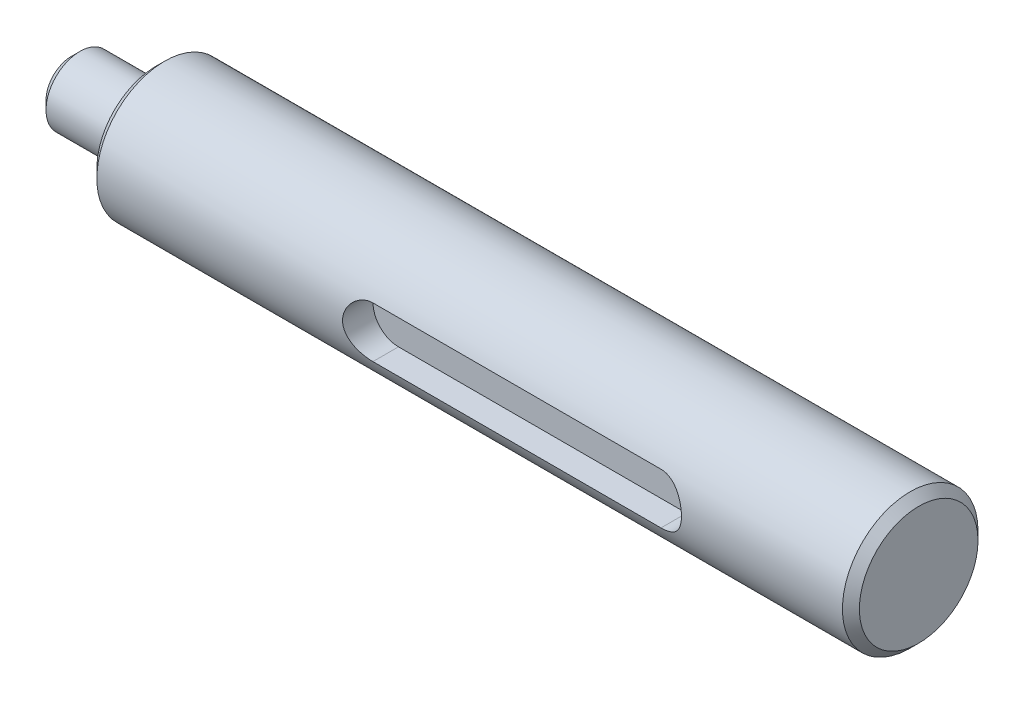
ISO-10303-21;
HEADER;
FILE_DESCRIPTION(('STEP AP214'),'2;1');
FILE_NAME('part.step','',(''),(''),'','','');
FILE_SCHEMA(('AUTOMOTIVE_DESIGN { 1 0 10303 214 1 1 1 1 }'));
ENDSEC;
DATA;
#1=APPLICATION_CONTEXT('core data for automotive mechanical design processes');
#2=APPLICATION_PROTOCOL_DEFINITION('international standard','automotive_design',2000,#1);
#3=PRODUCT_CONTEXT('',#1,'mechanical');
#4=PRODUCT('Part','Part','',(#3));
#5=PRODUCT_RELATED_PRODUCT_CATEGORY('part','',(#4));
#6=PRODUCT_DEFINITION_FORMATION('','',#4);
#7=PRODUCT_DEFINITION_CONTEXT('part definition',#1,'design');
#8=PRODUCT_DEFINITION('design','',#6,#7);
#9=PRODUCT_DEFINITION_SHAPE('','',#8);
#10=(LENGTH_UNIT() NAMED_UNIT(*) SI_UNIT(.MILLI.,.METRE.));
#11=(NAMED_UNIT(*) PLANE_ANGLE_UNIT() SI_UNIT($,.RADIAN.));
#12=(NAMED_UNIT(*) SI_UNIT($,.STERADIAN.) SOLID_ANGLE_UNIT());
#13=UNCERTAINTY_MEASURE_WITH_UNIT(LENGTH_MEASURE(1.E-05),#10,'distance_accuracy_value','');
#14=(GEOMETRIC_REPRESENTATION_CONTEXT(3) GLOBAL_UNCERTAINTY_ASSIGNED_CONTEXT((#13)) GLOBAL_UNIT_ASSIGNED_CONTEXT((#10,
#11,#12)) REPRESENTATION_CONTEXT('',''));
#15=CARTESIAN_POINT('',(0.,0.,0.));
#16=DIRECTION('',(0.,0.,1.));
#17=DIRECTION('',(1.,0.,0.));
#18=AXIS2_PLACEMENT_3D('',#15,#16,#17);
#19=CARTESIAN_POINT('',(-5.,0.,0.));
#20=DIRECTION('',(1.,0.,0.));
#21=DIRECTION('',(0.,0.,-1.));
#22=AXIS2_PLACEMENT_3D('',#19,#20,#21);
#23=PLANE('',#22);
#24=CARTESIAN_POINT('',(-5.,0.,0.));
#25=DIRECTION('',(1.,0.,0.));
#26=DIRECTION('',(0.,0.,-1.));
#27=AXIS2_PLACEMENT_3D('',#24,#25,#26);
#28=CIRCLE('',#27,1.5);
#29=CARTESIAN_POINT('',(-5.,0.,-1.5));
#30=VERTEX_POINT('',#29);
#31=EDGE_CURVE('E210',#30,#30,#28,.T.);
#32=ORIENTED_EDGE('',*,*,#31,.F.);
#33=EDGE_LOOP('',(#32));
#34=FACE_BOUND('',#33,.T.);
#35=ADVANCED_FACE('F17',(#34),#23,.F.);
#36=CARTESIAN_POINT('',(-5.,0.,0.));
#37=DIRECTION('',(1.,0.,0.));
#38=DIRECTION('',(0.,0.,-1.));
#39=AXIS2_PLACEMENT_3D('',#36,#37,#38);
#40=CONICAL_SURFACE('',#39,1.5,0.785398163397455);
#41=CARTESIAN_POINT('',(-4.5,0.,0.));
#42=DIRECTION('',(1.,0.,0.));
#43=DIRECTION('',(0.,0.,-1.));
#44=AXIS2_PLACEMENT_3D('',#41,#42,#43);
#45=CIRCLE('',#44,2.);
#46=CARTESIAN_POINT('',(-4.5,0.,-2.));
#47=VERTEX_POINT('',#46);
#48=EDGE_CURVE('E202',#47,#47,#45,.T.);
#49=ORIENTED_EDGE('',*,*,#48,.F.);
#50=EDGE_LOOP('',(#49));
#51=FACE_BOUND('',#50,.T.);
#52=ORIENTED_EDGE('',*,*,#31,.T.);
#53=EDGE_LOOP('',(#52));
#54=FACE_BOUND('',#53,.T.);
#55=ADVANCED_FACE('F167',(#51,#54),#40,.T.);
#56=CARTESIAN_POINT('',(45.,0.,0.));
#57=DIRECTION('',(1.,0.,0.));
#58=DIRECTION('',(0.,0.,-1.));
#59=AXIS2_PLACEMENT_3D('',#56,#57,#58);
#60=CYLINDRICAL_SURFACE('',#59,2.);
#61=CARTESIAN_POINT('',(-0.2,0.,0.));
#62=DIRECTION('',(1.,0.,0.));
#63=DIRECTION('',(0.,0.,-1.));
#64=AXIS2_PLACEMENT_3D('',#61,#62,#63);
#65=CIRCLE('',#64,2.);
#66=CARTESIAN_POINT('',(-0.2,0.,-2.));
#67=VERTEX_POINT('',#66);
#68=EDGE_CURVE('E198',#67,#67,#65,.T.);
#69=ORIENTED_EDGE('',*,*,#68,.F.);
#70=EDGE_LOOP('',(#69));
#71=FACE_BOUND('',#70,.T.);
#72=ORIENTED_EDGE('',*,*,#48,.T.);
#73=EDGE_LOOP('',(#72));
#74=FACE_BOUND('',#73,.T.);
#75=ADVANCED_FACE('F173',(#71,#74),#60,.T.);
#76=CARTESIAN_POINT('',(-0.200000000000017,0.,0.));
#77=DIRECTION('',(1.,0.,0.));
#78=DIRECTION('',(0.,0.,-1.));
#79=AXIS2_PLACEMENT_3D('',#76,#77,#78);
#80=TOROIDAL_SURFACE('',#79,2.2,0.200000000000017);
#81=CARTESIAN_POINT('',(0.,0.,0.));
#82=DIRECTION('',(1.,0.,0.));
#83=DIRECTION('',(0.,0.,-1.));
#84=AXIS2_PLACEMENT_3D('',#81,#82,#83);
#85=CIRCLE('',#84,2.2);
#86=CARTESIAN_POINT('',(0.,0.,-2.2));
#87=VERTEX_POINT('',#86);
#88=EDGE_CURVE('E197',#87,#87,#85,.T.);
#89=ORIENTED_EDGE('',*,*,#88,.F.);
#90=EDGE_LOOP('',(#89));
#91=FACE_BOUND('',#90,.T.);
#92=ORIENTED_EDGE('',*,*,#68,.T.);
#93=EDGE_LOOP('',(#92));
#94=FACE_BOUND('',#93,.T.);
#95=ADVANCED_FACE('F180',(#91,#94),#80,.F.);
#96=CARTESIAN_POINT('',(0.,2.2,0.));
#97=DIRECTION('',(1.,0.,0.));
#98=DIRECTION('',(0.,0.,-1.));
#99=AXIS2_PLACEMENT_3D('',#96,#97,#98);
#100=PLANE('',#99);
#101=CARTESIAN_POINT('',(0.,0.,0.));
#102=DIRECTION('',(1.,0.,0.));
#103=DIRECTION('',(0.,0.,-1.));
#104=AXIS2_PLACEMENT_3D('',#101,#102,#103);
#105=CIRCLE('',#104,3.5);
#106=CARTESIAN_POINT('',(0.,0.,-3.5));
#107=VERTEX_POINT('',#106);
#108=EDGE_CURVE('E194',#107,#107,#105,.T.);
#109=ORIENTED_EDGE('',*,*,#108,.F.);
#110=EDGE_LOOP('',(#109));
#111=FACE_BOUND('',#110,.T.);
#112=ORIENTED_EDGE('',*,*,#88,.T.);
#113=EDGE_LOOP('',(#112));
#114=FACE_BOUND('',#113,.T.);
#115=ADVANCED_FACE('F183',(#111,#114),#100,.F.);
#116=CARTESIAN_POINT('',(0.,0.,0.));
#117=DIRECTION('',(1.,0.,0.));
#118=DIRECTION('',(0.,0.,-1.));
#119=AXIS2_PLACEMENT_3D('',#116,#117,#118);
#120=CONICAL_SURFACE('',#119,3.5,0.785398163397448);
#121=CARTESIAN_POINT('',(0.5,0.,0.));
#122=DIRECTION('',(1.,0.,0.));
#123=DIRECTION('',(0.,0.,-1.));
#124=AXIS2_PLACEMENT_3D('',#121,#122,#123);
#125=CIRCLE('',#124,4.);
#126=CARTESIAN_POINT('',(0.5,0.,-4.));
#127=VERTEX_POINT('',#126);
#128=EDGE_CURVE('E90',#127,#127,#125,.T.);
#129=ORIENTED_EDGE('',*,*,#128,.F.);
#130=EDGE_LOOP('',(#129));
#131=FACE_BOUND('',#130,.T.);
#132=ORIENTED_EDGE('',*,*,#108,.T.);
#133=EDGE_LOOP('',(#132));
#134=FACE_BOUND('',#133,.T.);
#135=ADVANCED_FACE('F111',(#131,#134),#120,.T.);
#136=CARTESIAN_POINT('',(45.,0.,0.));
#137=DIRECTION('',(1.,0.,0.));
#138=DIRECTION('',(0.,0.,-1.));
#139=AXIS2_PLACEMENT_3D('',#136,#137,#138);
#140=CYLINDRICAL_SURFACE('',#139,4.);
#141=CARTESIAN_POINT('',(44.5,0.,0.));
#142=DIRECTION('',(1.,0.,0.));
#143=DIRECTION('',(0.,0.,-1.));
#144=AXIS2_PLACEMENT_3D('',#141,#142,#143);
#145=CIRCLE('',#144,4.);
#146=CARTESIAN_POINT('',(44.5,0.,-4.));
#147=VERTEX_POINT('',#146);
#148=EDGE_CURVE('E87',#147,#147,#145,.T.);
#149=ORIENTED_EDGE('',*,*,#148,.F.);
#150=EDGE_LOOP('',(#149));
#151=FACE_BOUND('',#150,.T.);
#152=DIRECTION('',(1.,0.,0.));
#153=VECTOR('',#152,1.);
#154=CARTESIAN_POINT('',(16.5,1.5,3.70809924354783));
#155=LINE('',#154,#153);
#156=CARTESIAN_POINT('',(16.5,1.5,3.70809924354783));
#157=VERTEX_POINT('',#156);
#158=CARTESIAN_POINT('',(33.5,1.5,3.70809924354783));
#159=VERTEX_POINT('',#158);
#160=EDGE_CURVE('E71',#157,#159,#155,.T.);
#161=ORIENTED_EDGE('',*,*,#160,.T.);
#162=CARTESIAN_POINT('',(33.5,1.5,3.70809924354783));
#163=CARTESIAN_POINT('',(33.5199450486581,1.50000089736899,3.70809856452194));
#164=CARTESIAN_POINT('',(33.5398904816375,1.49961124737892,3.70825648961619));
#165=CARTESIAN_POINT('',(33.5796340399623,1.49804869432538,3.70888816765675));
#166=CARTESIAN_POINT('',(33.5994323661552,1.49688017499157,3.70936015294496));
#167=CARTESIAN_POINT('',(33.6388825387993,1.49376374507018,3.71061619100091));
#168=CARTESIAN_POINT('',(33.6585346560803,1.4918187913755,3.71139905977317));
#169=CARTESIAN_POINT('',(33.697693113869,1.48715414794438,3.71327064511375));
#170=CARTESIAN_POINT('',(33.7171996639137,1.48443597633218,3.71435876230468));
#171=CARTESIAN_POINT('',(33.7560679004188,1.47822866178049,3.71683348672789));
#172=CARTESIAN_POINT('',(33.7754296059174,1.47473962207196,3.71822005399253));
#173=CARTESIAN_POINT('',(33.8140091478965,1.46699380876062,3.72128291475121));
#174=CARTESIAN_POINT('',(33.8332266930134,1.46273577328565,3.72295968425695));
#175=CARTESIAN_POINT('',(33.8715191427874,1.4534548854513,3.72659278835215));
#176=CARTESIAN_POINT('',(33.8905933400785,1.44842948130874,3.72855005430852));
#177=CARTESIAN_POINT('',(33.9286000094495,1.43761528232262,3.73273305403726));
#178=CARTESIAN_POINT('',(33.9475312683034,1.43182273696508,3.73496010187578));
#179=CARTESIAN_POINT('',(33.985168329086,1.41950699430011,3.73965820034778));
#180=CARTESIAN_POINT('',(34.0038735749353,1.41298229017736,3.74212975289855));
#181=CARTESIAN_POINT('',(34.0408951012299,1.39925302398884,3.74728494647122));
#182=CARTESIAN_POINT('',(34.0592128592872,1.39205202586604,3.7499674647739));
#183=CARTESIAN_POINT('',(34.0954584304663,1.37697300078356,3.75553054686646));
#184=CARTESIAN_POINT('',(34.1133874065149,1.36909749464294,3.75841036585242));
#185=CARTESIAN_POINT('',(34.1488594219785,1.35267293462389,3.7643528053963));
#186=CARTESIAN_POINT('',(34.1664031512844,1.34412523635835,3.76741505516591));
#187=CARTESIAN_POINT('',(34.2011085613983,1.32635906598519,3.77370645233928));
#188=CARTESIAN_POINT('',(34.2182703814861,1.31714084382769,3.7769355374234));
#189=CARTESIAN_POINT('',(34.2522159417151,1.29803631474787,3.7835438408551));
#190=CARTESIAN_POINT('',(34.26899920863,1.28814922738827,3.78692323295133));
#191=CARTESIAN_POINT('',(34.3021918757246,1.26770971937128,3.7938145309543));
#192=CARTESIAN_POINT('',(34.3186001469192,1.25715557808746,3.79732676932226));
#193=CARTESIAN_POINT('',(34.3510463192925,1.23538373386121,3.80446563644074));
#194=CARTESIAN_POINT('',(34.3670824081849,1.22416346725929,3.80809267818527));
#195=CARTESIAN_POINT('',(34.3987478822215,1.20109551185277,3.81543136818895));
#196=CARTESIAN_POINT('',(34.4143760025261,1.18924615383918,3.81914322495519));
#197=CARTESIAN_POINT('',(34.4450895144621,1.16501610604786,3.82660390758159));
#198=CARTESIAN_POINT('',(34.4601770051164,1.15263800487171,3.83035249657578));
#199=CARTESIAN_POINT('',(34.4897984519701,1.12735416450796,3.83786996434399));
#200=CARTESIAN_POINT('',(34.5043342455066,1.11445054116477,3.84163871718287));
#201=CARTESIAN_POINT('',(34.5328542980744,1.08811510673159,3.84918078191495));
#202=CARTESIAN_POINT('',(34.5468397407188,1.07468456901714,3.85295406374682));
#203=CARTESIAN_POINT('',(34.5742605789496,1.04729419068475,3.86048914558244));
#204=CARTESIAN_POINT('',(34.5876964388207,1.03333481686828,3.86425095268487));
#205=CARTESIAN_POINT('',(34.6140197999485,1.00488598186168,3.87174646042746));
#206=CARTESIAN_POINT('',(34.6269069906222,0.990396228849816,3.87548014418909));
#207=CARTESIAN_POINT('',(34.6521347898805,0.960886031135332,3.88290226084419));
#208=CARTESIAN_POINT('',(34.6644742718622,0.94586459734425,3.88659059012124));
#209=CARTESIAN_POINT('',(34.6886081831962,0.915290426695448,3.89390437994279));
#210=CARTESIAN_POINT('',(34.7004006430826,0.899736075080753,3.8975295877787));
#211=CARTESIAN_POINT('',(34.7234416800251,0.868098510736872,3.90469835573684));
#212=CARTESIAN_POINT('',(34.7346875164945,0.852013200770794,3.90824146547409));
#213=CARTESIAN_POINT('',(34.7565513756601,0.819434445163634,3.91520168747571));
#214=CARTESIAN_POINT('',(34.7671704034479,0.802941716594649,3.9186189979541));
#215=CARTESIAN_POINT('',(34.7877224622443,0.769614045226761,3.92530019992182));
#216=CARTESIAN_POINT('',(34.7976584918031,0.752781082748375,3.92856473884158));
#217=CARTESIAN_POINT('',(34.8168425606811,0.718772951170971,3.93492867875656));
#218=CARTESIAN_POINT('',(34.8260927865872,0.701599112488884,3.93802859478895));
#219=CARTESIAN_POINT('',(34.8439026880918,0.666908972708808,3.94405143664559));
#220=CARTESIAN_POINT('',(34.852463650375,0.649393389287445,3.94697468958522));
#221=CARTESIAN_POINT('',(34.8688927450906,0.61401987150133,3.9526320685094));
#222=CARTESIAN_POINT('',(34.8767611844706,0.596162093125522,3.95536627816737));
#223=CARTESIAN_POINT('',(34.8918029152238,0.560104476457852,3.96063319255055));
#224=CARTESIAN_POINT('',(34.8989754689702,0.541904299099427,3.96316568295882));
#225=CARTESIAN_POINT('',(34.9126234327671,0.505162482760767,3.96801652126187));
#226=CARTESIAN_POINT('',(34.9190970133416,0.486620089666016,3.97033430504127));
#227=CARTESIAN_POINT('',(34.9313441359663,0.449194437154995,3.97474286117349));
#228=CARTESIAN_POINT('',(34.9371147247672,0.430310098358728,3.97683267222212));
#229=CARTESIAN_POINT('',(34.9479529129768,0.392214942025615,3.98077077145582));
#230=CARTESIAN_POINT('',(34.9530169322277,0.373002978722608,3.98261782705184));
#231=CARTESIAN_POINT('',(34.9623847321422,0.334431890298367,3.98604177851591));
#232=CARTESIAN_POINT('',(34.9666907415375,0.315073377267811,3.98761946596504));
#233=CARTESIAN_POINT('',(34.9745202346462,0.276269646843665,3.99049518825004));
#234=CARTESIAN_POINT('',(34.9780471733009,0.256825218933224,3.9917944569881));
#235=CARTESIAN_POINT('',(34.9843190743405,0.217853921584761,3.99411060862672));
#236=CARTESIAN_POINT('',(34.9870663519509,0.198327474743152,3.99512832736641));
#237=CARTESIAN_POINT('',(34.991778490505,0.159196116709768,3.99687873484046));
#238=CARTESIAN_POINT('',(34.9937444694046,0.139591358470514,3.99761183080508));
#239=CARTESIAN_POINT('',(34.9968939152741,0.100307414369995,3.99879039637172));
#240=CARTESIAN_POINT('',(34.9980772619261,0.0806282175324005,3.99923582174851));
#241=CARTESIAN_POINT('',(34.9996612789958,0.0411993967179798,3.99983650156494));
#242=CARTESIAN_POINT('',(35.0000605737182,0.0214497097566775,3.99999124595597));
#243=CARTESIAN_POINT('',(35.0000764514507,-0.0181161360870476,4.00000805977239));
#244=CARTESIAN_POINT('',(34.9996904105448,-0.0379322962314546,3.9998691479908));
#245=CARTESIAN_POINT('',(34.9981351879993,-0.0776270725407904,3.99929618608449));
#246=CARTESIAN_POINT('',(34.9969621631572,-0.0975055163973702,3.99886068743215));
#247=CARTESIAN_POINT('',(34.9938416169736,-0.137223090792668,3.99769497621722));
#248=CARTESIAN_POINT('',(34.9918929268459,-0.157062116389304,3.99696431887947));
#249=CARTESIAN_POINT('',(34.9872267080505,-0.196541972565766,3.99521712031409));
#250=CARTESIAN_POINT('',(34.9845128479092,-0.216183296591103,3.99420194332114));
#251=CARTESIAN_POINT('',(34.9783204495627,-0.255262680106333,3.99189464356884));
#252=CARTESIAN_POINT('',(34.9748444385816,-0.274701194029206,3.99060343644653));
#253=CARTESIAN_POINT('',(34.9671323027238,-0.313372246727262,3.98775288734361));
#254=CARTESIAN_POINT('',(34.9628974884008,-0.33260508098722,3.98619400785915));
#255=CARTESIAN_POINT('',(34.9536721935787,-0.370862383722415,3.98281681696109));
#256=CARTESIAN_POINT('',(34.9486818310458,-0.389886884229085,3.98099854604965));
#257=CARTESIAN_POINT('',(34.9379498249106,-0.427725432529754,3.97711116041995));
#258=CARTESIAN_POINT('',(34.9322071519953,-0.446539152938039,3.97504170231701));
#259=CARTESIAN_POINT('',(34.9199750877886,-0.483954473328714,3.97066038210852));
#260=CARTESIAN_POINT('',(34.9134835854342,-0.50255530269457,3.9683478364134));
#261=CARTESIAN_POINT('',(34.8997574579093,-0.539543047472781,3.96348871229549));
#262=CARTESIAN_POINT('',(34.8925197183396,-0.557928677839426,3.96094115814073));
#263=CARTESIAN_POINT('',(34.8773414959637,-0.594405549589216,3.95563170066709));
#264=CARTESIAN_POINT('',(34.8694000780712,-0.612496360254044,3.9528695127492));
#265=CARTESIAN_POINT('',(34.8528674043422,-0.648249633234827,3.94716336986651));
#266=CARTESIAN_POINT('',(34.8442792013246,-0.665913644859606,3.94422027954586));
#267=CARTESIAN_POINT('',(34.8264554507235,-0.700811779758493,3.93816905470476));
#268=CARTESIAN_POINT('',(34.8172220153192,-0.718047076374335,3.93506146609069));
#269=CARTESIAN_POINT('',(34.7981112192282,-0.752089365050631,3.92869710372997));
#270=CARTESIAN_POINT('',(34.7882349737999,-0.768897032077975,3.92544059113624));
#271=CARTESIAN_POINT('',(34.7678415252772,-0.802085862639763,3.91879377204522));
#272=CARTESIAN_POINT('',(34.7573244806554,-0.818467130206,3.91540349870009));
#273=CARTESIAN_POINT('',(34.7356524065632,-0.850805326183809,3.90850405870109));
#274=CARTESIAN_POINT('',(34.7244966335254,-0.866761726994714,3.90499475549921));
#275=CARTESIAN_POINT('',(34.7015502349587,-0.898252885828872,3.89787160362012));
#276=CARTESIAN_POINT('',(34.6897580330447,-0.913786438681743,3.89425750667078));
#277=CARTESIAN_POINT('',(34.6655409008703,-0.944434088717742,3.88693883295457));
#278=CARTESIAN_POINT('',(34.6531136381786,-0.959546269436205,3.88323395321616));
#279=CARTESIAN_POINT('',(34.627672438963,-0.989309289100827,3.87575837909199));
#280=CARTESIAN_POINT('',(34.6146573083014,-1.00395907593639,3.871987561245));
#281=CARTESIAN_POINT('',(34.588139422907,-1.03267729410848,3.86442713168466));
#282=CARTESIAN_POINT('',(34.5746391666374,-1.04674807495339,3.86063768445456));
#283=CARTESIAN_POINT('',(34.54715196937,-1.07430126473969,3.85306114950972));
#284=CARTESIAN_POINT('',(34.533166971937,-1.08778562323666,3.84927410312045));
#285=CARTESIAN_POINT('',(34.5047090660023,-1.11416741510404,3.84172081417597));
#286=CARTESIAN_POINT('',(34.4902373253175,-1.12706610004442,3.83795454398939));
#287=CARTESIAN_POINT('',(34.4608040197574,-1.15227769663887,3.83046066755321));
#288=CARTESIAN_POINT('',(34.4458428688493,-1.16459108279046,3.82673303196849));
#289=CARTESIAN_POINT('',(34.4154289717717,-1.18863359128592,3.81933351452422));
#290=CARTESIAN_POINT('',(34.3999759214246,-1.20036234013546,3.81566166932152));
#291=CARTESIAN_POINT('',(34.368576421583,-1.22323729974505,3.80839006097582));
#292=CARTESIAN_POINT('',(34.3526290012407,-1.23438223123663,3.80479046598179));
#293=CARTESIAN_POINT('',(34.3202387020509,-1.25609112912262,3.79767903037953));
#294=CARTESIAN_POINT('',(34.3037942502823,-1.26665286663717,3.79416755112899));
#295=CARTESIAN_POINT('',(34.2704103848882,-1.28719699769113,3.78724728210048));
#296=CARTESIAN_POINT('',(34.2534689222676,-1.2971762608498,3.78383908744704));
#297=CARTESIAN_POINT('',(34.2192247413795,-1.31647638577798,3.77716744893967));
#298=CARTESIAN_POINT('',(34.201922662223,-1.32579830211568,3.77390377651309));
#299=CARTESIAN_POINT('',(34.1670349489381,-1.3437262453162,3.76755753365013));
#300=CARTESIAN_POINT('',(34.149451249596,-1.3523357326521,3.76447411213181));
#301=CARTESIAN_POINT('',(34.1139987115551,-1.36883818369329,3.75850485354708));
#302=CARTESIAN_POINT('',(34.0961311694597,-1.37673368203501,3.75561832726538));
#303=CARTESIAN_POINT('',(34.0601088391496,-1.39180678831751,3.7500584353093));
#304=CARTESIAN_POINT('',(34.0419547469106,-1.39898589533773,3.74738462699791));
#305=CARTESIAN_POINT('',(34.0053573089996,-1.41262495386334,3.74226452584361));
#306=CARTESIAN_POINT('',(33.9869141141335,-1.41908526695052,3.73981811871176));
#307=CARTESIAN_POINT('',(33.9497363434258,-1.43128512703357,3.73516606971231));
#308=CARTESIAN_POINT('',(33.9310014487813,-1.43702381258892,3.73296071600434));
#309=CARTESIAN_POINT('',(33.8932381684067,-1.44777906926282,3.72880263679225));
#310=CARTESIAN_POINT('',(33.8742090874566,-1.45279349121153,3.72685066483768));
#311=CARTESIAN_POINT('',(33.8358548924361,-1.46209677665177,3.72321072599105));
#312=CARTESIAN_POINT('',(33.8165288125707,-1.46638215334576,3.72152403058298));
#313=CARTESIAN_POINT('',(33.7775904911469,-1.47422803480183,3.71842299352297));
#314=CARTESIAN_POINT('',(33.7579772385128,-1.47778417267152,3.71701029522605));
#315=CARTESIAN_POINT('',(33.7186194761666,-1.48411781325269,3.71448596230769));
#316=CARTESIAN_POINT('',(33.6988750636707,-1.48689583835951,3.71337412571621));
#317=CARTESIAN_POINT('',(33.659306602124,-1.49165778414401,3.71146380638784));
#318=CARTESIAN_POINT('',(33.6394827236396,-1.49364292730046,3.7106648412979));
#319=CARTESIAN_POINT('',(33.5997555254359,-1.49682013108245,3.70938439685059));
#320=CARTESIAN_POINT('',(33.5798521844114,-1.49801196231125,3.70890300932537));
#321=CARTESIAN_POINT('',(33.5399659296075,-1.4996032574204,3.70825972258939));
#322=CARTESIAN_POINT('',(33.5199829367162,-1.50000101677856,3.70809851065828));
#323=CARTESIAN_POINT('',(33.5,-1.5,3.70809924354783));
#324=B_SPLINE_CURVE_WITH_KNOTS('',3,(#162,#163,#164,#165,#166,#167,#168,#169,#170,#171,#172,
#173,#174,#175,#176,#177,#178,#179,#180,#181,#182,#183,#184,#185,#186,#187,#188,#189,#190,#191,
#192,#193,#194,#195,#196,#197,#198,#199,#200,#201,#202,#203,#204,#205,#206,#207,#208,#209,#210,
#211,#212,#213,#214,#215,#216,#217,#218,#219,#220,#221,#222,#223,#224,#225,#226,#227,#228,#229,
#230,#231,#232,#233,#234,#235,#236,#237,#238,#239,#240,#241,#242,#243,#244,#245,#246,#247,#248,
#249,#250,#251,#252,#253,#254,#255,#256,#257,#258,#259,#260,#261,#262,#263,#264,#265,#266,#267,
#268,#269,#270,#271,#272,#273,#274,#275,#276,#277,#278,#279,#280,#281,#282,#283,#284,#285,#286,
#287,#288,#289,#290,#291,#292,#293,#294,#295,#296,#297,#298,#299,#300,#301,#302,#303,#304,#305,
#306,#307,#308,#309,#310,#311,#312,#313,#314,#315,#316,#317,#318,#319,#320,#321,#322,#323),
.UNSPECIFIED.,.F.,.F.,(4,2,2,2,2,2,2,2,2,2,2,2,2,2,2,2,2,2,2,2,2,2,2,2,2,2,2,2,2,2,2,2,2,2,2,2,
2,2,2,2,2,2,2,2,2,2,2,2,2,2,2,2,2,2,2,2,2,2,2,2,2,2,2,2,2,2,2,2,2,2,2,2,2,2,2,2,2,2,2,2,4),(0.,
0.0598312333103517,0.119328528938099,0.17860137031588,0.237758630163387,0.296907972750733,
0.356155272355754,0.415604063396811,0.475355035969799,0.535231315669117,0.594808090567642,
0.6541711910058,0.713417501185492,0.772641838290555,0.831936512156359,0.891390923492462,
0.951091208648317,1.01095869623459,1.07056075829167,1.12994285805385,1.18918936136678,
1.24838473383039,1.30761318096651,1.36695829052458,1.42650268446661,1.48631999630579,
1.54603862825969,1.60547567164327,1.66471423909523,1.72383952711829,1.78293847560562,
1.84209939879477,1.90141159514039,1.96096494457237,2.02080986689141,2.08047577982744,
2.13987152952181,2.19908901084421,2.25822145044738,2.31736297865517,2.37660818402172,
2.43605166097448,2.49578756129003,2.55561381554401,2.61515797905046,2.67450760758544,
2.7337557025429,2.79299455643119,2.85231532451712,2.91180761362997,2.9715590971528,
3.03139120790122,3.09095675188133,3.15033569828945,3.20961423684283,3.2688781745824,
3.32821256471929,3.38770134582774,3.44742699890183,3.50727996874194,3.56685958798459,
3.6262230343174,3.68545299716065,3.74463409384541,3.80385252602292,3.86319571190261,
3.92275190194718,3.98260322942064,4.04235624477203,4.10179951806687,4.16102272714834,
4.22011928926929,4.27918598777651,4.33832254076978,4.39763112016236,4.45721583208633,
4.51714755634882,4.57703894775652,4.63683763780492,4.69665361194096,4.7565978471323),.UNSPECIFIED.);
#325=CARTESIAN_POINT('',(33.5,-1.5,3.70809924354783));
#326=VERTEX_POINT('',#325);
#327=EDGE_CURVE('E59',#159,#326,#324,.T.);
#328=ORIENTED_EDGE('',*,*,#327,.T.);
#329=DIRECTION('',(-1.,0.,0.));
#330=VECTOR('',#329,1.);
#331=CARTESIAN_POINT('',(33.5,-1.5,3.70809924354783));
#332=LINE('',#331,#330);
#333=CARTESIAN_POINT('',(16.5,-1.5,3.70809924354783));
#334=VERTEX_POINT('',#333);
#335=EDGE_CURVE('E70',#326,#334,#332,.T.);
#336=ORIENTED_EDGE('',*,*,#335,.T.);
#337=CARTESIAN_POINT('',(16.5,-1.5,3.70809924354783));
#338=CARTESIAN_POINT('',(16.4800549513419,-1.50000089736899,3.70809856452194));
#339=CARTESIAN_POINT('',(16.4601095183624,-1.49961124737892,3.70825648961619));
#340=CARTESIAN_POINT('',(16.4203659600377,-1.49804869432538,3.70888816765675));
#341=CARTESIAN_POINT('',(16.4005676338448,-1.49688017499157,3.70936015294496));
#342=CARTESIAN_POINT('',(16.3611174612007,-1.49376374507018,3.71061619100091));
#343=CARTESIAN_POINT('',(16.3414653439197,-1.4918187913755,3.71139905977317));
#344=CARTESIAN_POINT('',(16.302306886131,-1.48715414794438,3.71327064511376));
#345=CARTESIAN_POINT('',(16.2828003360863,-1.48443597633218,3.71435876230468));
#346=CARTESIAN_POINT('',(16.2439320995812,-1.47822866178049,3.71683348672789));
#347=CARTESIAN_POINT('',(16.2245703940826,-1.47473962207196,3.71822005399253));
#348=CARTESIAN_POINT('',(16.1859908521035,-1.46699380876062,3.72128291475121));
#349=CARTESIAN_POINT('',(16.1667733069865,-1.46273577328565,3.72295968425695));
#350=CARTESIAN_POINT('',(16.1284808572126,-1.4534548854513,3.72659278835215));
#351=CARTESIAN_POINT('',(16.1094066599215,-1.44842948130874,3.72855005430852));
#352=CARTESIAN_POINT('',(16.0713999905505,-1.43761528232262,3.73273305403726));
#353=CARTESIAN_POINT('',(16.0524687316965,-1.43182273696509,3.73496010187578));
#354=CARTESIAN_POINT('',(16.014831670914,-1.41950699430011,3.73965820034778));
#355=CARTESIAN_POINT('',(15.9961264250647,-1.41298229017735,3.74212975289855));
#356=CARTESIAN_POINT('',(15.9591048987701,-1.39925302398883,3.74728494647122));
#357=CARTESIAN_POINT('',(15.9407871407128,-1.39205202586604,3.7499674647739));
#358=CARTESIAN_POINT('',(15.9045415695337,-1.37697300078356,3.75553054686646));
#359=CARTESIAN_POINT('',(15.8866125934851,-1.36909749464294,3.75841036585242));
#360=CARTESIAN_POINT('',(15.8511405780215,-1.35267293462389,3.7643528053963));
#361=CARTESIAN_POINT('',(15.8335968487156,-1.34412523635834,3.76741505516591));
#362=CARTESIAN_POINT('',(15.7988914386017,-1.32635906598519,3.77370645233929));
#363=CARTESIAN_POINT('',(15.7817296185139,-1.31714084382769,3.7769355374234));
#364=CARTESIAN_POINT('',(15.7477840582849,-1.29803631474788,3.7835438408551));
#365=CARTESIAN_POINT('',(15.73100079137,-1.28814922738827,3.78692323295133));
#366=CARTESIAN_POINT('',(15.6978081242753,-1.26770971937128,3.7938145309543));
#367=CARTESIAN_POINT('',(15.6813998530808,-1.25715557808746,3.79732676932226));
#368=CARTESIAN_POINT('',(15.6489536807075,-1.23538373386121,3.80446563644074));
#369=CARTESIAN_POINT('',(15.6329175918151,-1.22416346725929,3.80809267818527));
#370=CARTESIAN_POINT('',(15.6012521177784,-1.20109551185277,3.81543136818895));
#371=CARTESIAN_POINT('',(15.5856239974739,-1.18924615383918,3.81914322495518));
#372=CARTESIAN_POINT('',(15.5549104855379,-1.16501610604787,3.82660390758158));
#373=CARTESIAN_POINT('',(15.5398229948836,-1.15263800487171,3.83035249657578));
#374=CARTESIAN_POINT('',(15.5102015480299,-1.12735416450796,3.83786996434399));
#375=CARTESIAN_POINT('',(15.4956657544934,-1.11445054116477,3.84163871718287));
#376=CARTESIAN_POINT('',(15.4671457019255,-1.08811510673159,3.84918078191495));
#377=CARTESIAN_POINT('',(15.4531602592812,-1.07468456901714,3.85295406374682));
#378=CARTESIAN_POINT('',(15.4257394210504,-1.04729419068475,3.86048914558244));
#379=CARTESIAN_POINT('',(15.4123035611793,-1.03333481686828,3.86425095268487));
#380=CARTESIAN_POINT('',(15.3859802000515,-1.00488598186168,3.87174646042746));
#381=CARTESIAN_POINT('',(15.3730930093778,-0.990396228849816,3.87548014418909));
#382=CARTESIAN_POINT('',(15.3478652101195,-0.960886031135329,3.88290226084419));
#383=CARTESIAN_POINT('',(15.3355257281378,-0.945864597344244,3.88659059012124));
#384=CARTESIAN_POINT('',(15.3113918168038,-0.915290426695439,3.89390437994279));
#385=CARTESIAN_POINT('',(15.2995993569174,-0.899736075080744,3.8975295877787));
#386=CARTESIAN_POINT('',(15.276558319975,-0.868098510736867,3.90469835573684));
#387=CARTESIAN_POINT('',(15.2653124835055,-0.852013200770793,3.90824146547409));
#388=CARTESIAN_POINT('',(15.2434486243399,-0.81943444516363,3.91520168747571));
#389=CARTESIAN_POINT('',(15.2328295965522,-0.802941716594639,3.9186189979541));
#390=CARTESIAN_POINT('',(15.2122775377557,-0.769614045226749,3.92530019992182));
#391=CARTESIAN_POINT('',(15.2023415081969,-0.752781082748366,3.92856473884158));
#392=CARTESIAN_POINT('',(15.1831574393189,-0.718772951170964,3.93492867875656));
#393=CARTESIAN_POINT('',(15.1739072134128,-0.701599112488877,3.93802859478896));
#394=CARTESIAN_POINT('',(15.1560973119082,-0.666908972708803,3.94405143664559));
#395=CARTESIAN_POINT('',(15.147536349625,-0.649393389287443,3.94697468958522));
#396=CARTESIAN_POINT('',(15.1311072549094,-0.614019871501331,3.9526320685094));
#397=CARTESIAN_POINT('',(15.1232388155294,-0.596162093125523,3.95536627816737));
#398=CARTESIAN_POINT('',(15.1081970847762,-0.560104476457853,3.96063319255055));
#399=CARTESIAN_POINT('',(15.1010245310298,-0.541904299099428,3.96316568295882));
#400=CARTESIAN_POINT('',(15.0873765672329,-0.505162482760769,3.96801652126187));
#401=CARTESIAN_POINT('',(15.0809029866584,-0.486620089666019,3.97033430504127));
#402=CARTESIAN_POINT('',(15.0686558640337,-0.449194437154999,3.97474286117349));
#403=CARTESIAN_POINT('',(15.0628852752328,-0.430310098358732,3.97683267222212));
#404=CARTESIAN_POINT('',(15.0520470870232,-0.39221494202562,3.98077077145582));
#405=CARTESIAN_POINT('',(15.0469830677723,-0.373002978722613,3.98261782705183));
#406=CARTESIAN_POINT('',(15.0376152678578,-0.334431890298374,3.98604177851591));
#407=CARTESIAN_POINT('',(15.0333092584625,-0.315073377267818,3.98761946596504));
#408=CARTESIAN_POINT('',(15.0254797653538,-0.27626964684367,3.99049518825004));
#409=CARTESIAN_POINT('',(15.0219528266991,-0.256825218933226,3.9917944569881));
#410=CARTESIAN_POINT('',(15.0156809256595,-0.217853921584762,3.99411060862672));
#411=CARTESIAN_POINT('',(15.0129336480491,-0.198327474743155,3.99512832736641));
#412=CARTESIAN_POINT('',(15.008221509495,-0.159196116709772,3.99687873484046));
#413=CARTESIAN_POINT('',(15.0062555305954,-0.139591358470517,3.99761183080508));
#414=CARTESIAN_POINT('',(15.0031060847259,-0.100307414369998,3.99879039637172));
#415=CARTESIAN_POINT('',(15.0019227380739,-0.0806282175324042,3.99923582174851));
#416=CARTESIAN_POINT('',(15.0003387210042,-0.0411993967179831,3.99983650156494));
#417=CARTESIAN_POINT('',(14.9999394262818,-0.0214497097566795,3.99999124595597));
#418=CARTESIAN_POINT('',(14.9999235485493,0.0181161360870457,4.00000805977239));
#419=CARTESIAN_POINT('',(15.0003095894552,0.0379322962314514,3.9998691479908));
#420=CARTESIAN_POINT('',(15.0018648120007,0.0776270725407867,3.99929618608449));
#421=CARTESIAN_POINT('',(15.0030378368428,0.0975055163973671,3.99886068743215));
#422=CARTESIAN_POINT('',(15.0061583830264,0.137223090792665,3.99769497621722));
#423=CARTESIAN_POINT('',(15.0081070731541,0.1570621163893,3.99696431887947));
#424=CARTESIAN_POINT('',(15.0127732919495,0.196541972565761,3.99521712031409));
#425=CARTESIAN_POINT('',(15.0154871520908,0.216183296591099,3.99420194332114));
#426=CARTESIAN_POINT('',(15.0216795504373,0.255262680106331,3.99189464356884));
#427=CARTESIAN_POINT('',(15.0251555614184,0.274701194029205,3.99060343644653));
#428=CARTESIAN_POINT('',(15.0328676972762,0.313372246727261,3.98775288734361));
#429=CARTESIAN_POINT('',(15.0371025115992,0.332605080987217,3.98619400785915));
#430=CARTESIAN_POINT('',(15.0463278064213,0.370862383722412,3.98281681696109));
#431=CARTESIAN_POINT('',(15.0513181689542,0.389886884229084,3.98099854604965));
#432=CARTESIAN_POINT('',(15.0620501750894,0.427725432529754,3.97711116041995));
#433=CARTESIAN_POINT('',(15.0677928480047,0.446539152938038,3.97504170231701));
#434=CARTESIAN_POINT('',(15.0800249122114,0.483954473328713,3.97066038210852));
#435=CARTESIAN_POINT('',(15.0865164145658,0.502555302694569,3.9683478364134));
#436=CARTESIAN_POINT('',(15.1002425420906,0.539543047472782,3.96348871229549));
#437=CARTESIAN_POINT('',(15.1074802816603,0.557928677839428,3.96094115814073));
#438=CARTESIAN_POINT('',(15.1226585040362,0.594405549589217,3.95563170066709));
#439=CARTESIAN_POINT('',(15.1305999219288,0.612496360254044,3.9528695127492));
#440=CARTESIAN_POINT('',(15.1471325956578,0.648249633234826,3.94716336986651));
#441=CARTESIAN_POINT('',(15.1557207986754,0.665913644859606,3.94422027954586));
#442=CARTESIAN_POINT('',(15.1735445492765,0.700811779758497,3.93816905470476));
#443=CARTESIAN_POINT('',(15.1827779846808,0.71804707637434,3.93506146609069));
#444=CARTESIAN_POINT('',(15.2018887807718,0.752089365050638,3.92869710372997));
#445=CARTESIAN_POINT('',(15.2117650262001,0.768897032077981,3.92544059113624));
#446=CARTESIAN_POINT('',(15.2321584747228,0.802085862639768,3.91879377204522));
#447=CARTESIAN_POINT('',(15.2426755193446,0.818467130206004,3.91540349870009));
#448=CARTESIAN_POINT('',(15.2643475934368,0.850805326183813,3.90850405870109));
#449=CARTESIAN_POINT('',(15.2755033664746,0.866761726994717,3.90499475549921));
#450=CARTESIAN_POINT('',(15.2984497650413,0.898252885828876,3.89787160362012));
#451=CARTESIAN_POINT('',(15.3102419669553,0.913786438681748,3.89425750667078));
#452=CARTESIAN_POINT('',(15.3344590991297,0.944434088717749,3.88693883295456));
#453=CARTESIAN_POINT('',(15.3468863618214,0.959546269436214,3.88323395321616));
#454=CARTESIAN_POINT('',(15.372327561037,0.989309289100836,3.87575837909199));
#455=CARTESIAN_POINT('',(15.3853426916986,1.00395907593639,3.871987561245));
#456=CARTESIAN_POINT('',(15.411860577093,1.03267729410848,3.86442713168466));
#457=CARTESIAN_POINT('',(15.4253608333626,1.0467480749534,3.86063768445455));
#458=CARTESIAN_POINT('',(15.45284803063,1.0743012647397,3.85306114950972));
#459=CARTESIAN_POINT('',(15.466833028063,1.08778562323667,3.84927410312045));
#460=CARTESIAN_POINT('',(15.4952909339977,1.11416741510405,3.84172081417596));
#461=CARTESIAN_POINT('',(15.5097626746825,1.12706610004442,3.83795454398939));
#462=CARTESIAN_POINT('',(15.5391959802426,1.15227769663887,3.83046066755321));
#463=CARTESIAN_POINT('',(15.5541571311507,1.16459108279046,3.82673303196849));
#464=CARTESIAN_POINT('',(15.5845710282283,1.18863359128592,3.81933351452421));
#465=CARTESIAN_POINT('',(15.6000240785754,1.20036234013547,3.81566166932152));
#466=CARTESIAN_POINT('',(15.631423578417,1.22323729974506,3.80839006097582));
#467=CARTESIAN_POINT('',(15.6473709987593,1.23438223123663,3.80479046598179));
#468=CARTESIAN_POINT('',(15.6797612979491,1.25609112912262,3.79767903037953));
#469=CARTESIAN_POINT('',(15.6962057497177,1.26665286663717,3.79416755112899));
#470=CARTESIAN_POINT('',(15.7295896151118,1.28719699769113,3.78724728210047));
#471=CARTESIAN_POINT('',(15.7465310777324,1.2971762608498,3.78383908744704));
#472=CARTESIAN_POINT('',(15.7807752586205,1.31647638577798,3.77716744893967));
#473=CARTESIAN_POINT('',(15.798077337777,1.32579830211567,3.77390377651309));
#474=CARTESIAN_POINT('',(15.8329650510619,1.3437262453162,3.76755753365013));
#475=CARTESIAN_POINT('',(15.850548750404,1.3523357326521,3.76447411213181));
#476=CARTESIAN_POINT('',(15.8860012884449,1.36883818369329,3.75850485354708));
#477=CARTESIAN_POINT('',(15.9038688305403,1.37673368203501,3.75561832726538));
#478=CARTESIAN_POINT('',(15.9398911608504,1.39180678831751,3.7500584353093));
#479=CARTESIAN_POINT('',(15.9580452530894,1.39898589533774,3.74738462699791));
#480=CARTESIAN_POINT('',(15.9946426910004,1.41262495386334,3.74226452584361));
#481=CARTESIAN_POINT('',(16.0130858858665,1.41908526695052,3.73981811871176));
#482=CARTESIAN_POINT('',(16.0502636565742,1.43128512703357,3.73516606971231));
#483=CARTESIAN_POINT('',(16.0689985512186,1.43702381258892,3.73296071600434));
#484=CARTESIAN_POINT('',(16.1067618315933,1.44777906926282,3.72880263679225));
#485=CARTESIAN_POINT('',(16.1257909125434,1.45279349121153,3.72685066483768));
#486=CARTESIAN_POINT('',(16.1641451075639,1.46209677665177,3.72321072599104));
#487=CARTESIAN_POINT('',(16.1834711874293,1.46638215334576,3.72152403058298));
#488=CARTESIAN_POINT('',(16.2224095088531,1.47422803480183,3.71842299352297));
#489=CARTESIAN_POINT('',(16.2420227614872,1.47778417267152,3.71701029522605));
#490=CARTESIAN_POINT('',(16.2813805238334,1.48411781325269,3.71448596230769));
#491=CARTESIAN_POINT('',(16.3011249363293,1.48689583835951,3.7133741257162));
#492=CARTESIAN_POINT('',(16.340693397876,1.49165778414402,3.71146380638784));
#493=CARTESIAN_POINT('',(16.3605172763604,1.49364292730046,3.7106648412979));
#494=CARTESIAN_POINT('',(16.4002444745641,1.49682013108245,3.70938439685059));
#495=CARTESIAN_POINT('',(16.4201478155886,1.49801196231125,3.70890300932537));
#496=CARTESIAN_POINT('',(16.4600340703925,1.4996032574204,3.70825972258939));
#497=CARTESIAN_POINT('',(16.4800170632838,1.50000101677856,3.70809851065828));
#498=CARTESIAN_POINT('',(16.5,1.5,3.70809924354783));
#499=B_SPLINE_CURVE_WITH_KNOTS('',3,(#337,#338,#339,#340,#341,#342,#343,#344,#345,#346,#347,
#348,#349,#350,#351,#352,#353,#354,#355,#356,#357,#358,#359,#360,#361,#362,#363,#364,#365,#366,
#367,#368,#369,#370,#371,#372,#373,#374,#375,#376,#377,#378,#379,#380,#381,#382,#383,#384,#385,
#386,#387,#388,#389,#390,#391,#392,#393,#394,#395,#396,#397,#398,#399,#400,#401,#402,#403,#404,
#405,#406,#407,#408,#409,#410,#411,#412,#413,#414,#415,#416,#417,#418,#419,#420,#421,#422,#423,
#424,#425,#426,#427,#428,#429,#430,#431,#432,#433,#434,#435,#436,#437,#438,#439,#440,#441,#442,
#443,#444,#445,#446,#447,#448,#449,#450,#451,#452,#453,#454,#455,#456,#457,#458,#459,#460,#461,
#462,#463,#464,#465,#466,#467,#468,#469,#470,#471,#472,#473,#474,#475,#476,#477,#478,#479,#480,
#481,#482,#483,#484,#485,#486,#487,#488,#489,#490,#491,#492,#493,#494,#495,#496,#497,#498),
.UNSPECIFIED.,.F.,.F.,(4,2,2,2,2,2,2,2,2,2,2,2,2,2,2,2,2,2,2,2,2,2,2,2,2,2,2,2,2,2,2,2,2,2,2,2,
2,2,2,2,2,2,2,2,2,2,2,2,2,2,2,2,2,2,2,2,2,2,2,2,2,2,2,2,2,2,2,2,2,2,2,2,2,2,2,2,2,2,2,2,4),(0.,
0.0598312333103586,0.119328528938103,0.178601370315884,0.237758630163391,0.296907972750744,
0.356155272355761,0.415604063396815,0.47535503596981,0.535231315669118,0.594808090567649,
0.654171191005805,0.713417501185495,0.772641838290563,0.831936512156368,0.891390923492471,
0.95109120864832,1.01095869623459,1.07056075829168,1.12994285805386,1.18918936136679,
1.2483847338304,1.30761318096652,1.36695829052459,1.42650268446661,1.4863199963058,
1.5460386282597,1.60547567164327,1.66471423909523,1.72383952711829,1.78293847560562,
1.84209939879477,1.90141159514039,1.96096494457237,2.02080986689141,2.08047577982743,
2.13987152952182,2.19908901084421,2.25822145044738,2.31736297865517,2.37660818402172,
2.43605166097448,2.49578756129003,2.55561381554401,2.61515797905046,2.67450760758545,
2.7337557025429,2.79299455643119,2.85231532451712,2.91180761362997,2.9715590971528,
3.03139120790122,3.09095675188134,3.15033569828946,3.20961423684283,3.26887817458241,
3.3282125647193,3.38770134582775,3.44742699890184,3.50727996874196,3.5668595879846,
3.62622303431741,3.68545299716065,3.74463409384541,3.80385252602292,3.86319571190262,
3.92275190194718,3.98260322942065,4.04235624477203,4.10179951806688,4.16102272714835,
4.2201192892693,4.27918598777651,4.33832254076978,4.39763112016236,4.45721583208633,
4.51714755634882,4.57703894775653,4.63683763780492,4.69665361194097,4.75659784713231),.UNSPECIFIED.);
#500=EDGE_CURVE('E85',#334,#157,#499,.T.);
#501=ORIENTED_EDGE('',*,*,#500,.T.);
#502=EDGE_LOOP('',(#161,#328,#336,#501));
#503=FACE_BOUND('',#502,.T.);
#504=ORIENTED_EDGE('',*,*,#128,.T.);
#505=EDGE_LOOP('',(#504));
#506=FACE_BOUND('',#505,.T.);
#507=ADVANCED_FACE('F83',(#151,#503,#506),#140,.T.);
#508=CARTESIAN_POINT('',(44.5,0.,0.));
#509=DIRECTION('',(-1.,0.,0.));
#510=DIRECTION('',(0.,0.,1.));
#511=AXIS2_PLACEMENT_3D('',#508,#509,#510);
#512=CONICAL_SURFACE('',#511,4.,0.785398163397448);
#513=CARTESIAN_POINT('',(45.,0.,0.));
#514=DIRECTION('',(1.,0.,0.));
#515=DIRECTION('',(0.,0.,-1.));
#516=AXIS2_PLACEMENT_3D('',#513,#514,#515);
#517=CIRCLE('',#516,3.5);
#518=CARTESIAN_POINT('',(45.,0.,-3.5));
#519=VERTEX_POINT('',#518);
#520=EDGE_CURVE('E120',#519,#519,#517,.T.);
#521=ORIENTED_EDGE('',*,*,#520,.F.);
#522=EDGE_LOOP('',(#521));
#523=FACE_BOUND('',#522,.T.);
#524=ORIENTED_EDGE('',*,*,#148,.T.);
#525=EDGE_LOOP('',(#524));
#526=FACE_BOUND('',#525,.T.);
#527=ADVANCED_FACE('F110',(#523,#526),#512,.T.);
#528=CARTESIAN_POINT('',(33.5,1.5,2.2));
#529=DIRECTION('',(0.,1.,0.));
#530=DIRECTION('',(0.,0.,1.));
#531=AXIS2_PLACEMENT_3D('',#528,#529,#530);
#532=PLANE('',#531);
#533=DIRECTION('',(0.,0.,1.));
#534=VECTOR('',#533,1.);
#535=CARTESIAN_POINT('',(16.5,1.5,2.2));
#536=LINE('',#535,#534);
#537=CARTESIAN_POINT('',(16.5,1.5,2.2));
#538=VERTEX_POINT('',#537);
#539=EDGE_CURVE('E128',#538,#157,#536,.T.);
#540=ORIENTED_EDGE('',*,*,#539,.F.);
#541=DIRECTION('',(-1.,0.,0.));
#542=VECTOR('',#541,1.);
#543=CARTESIAN_POINT('',(33.5,1.5,2.2));
#544=LINE('',#543,#542);
#545=CARTESIAN_POINT('',(33.5,1.5,2.2));
#546=VERTEX_POINT('',#545);
#547=EDGE_CURVE('E79',#546,#538,#544,.T.);
#548=ORIENTED_EDGE('',*,*,#547,.F.);
#549=DIRECTION('',(0.,0.,1.));
#550=VECTOR('',#549,1.);
#551=CARTESIAN_POINT('',(33.5,1.5,2.2));
#552=LINE('',#551,#550);
#553=EDGE_CURVE('E63',#546,#159,#552,.T.);
#554=ORIENTED_EDGE('',*,*,#553,.T.);
#555=ORIENTED_EDGE('',*,*,#160,.F.);
#556=EDGE_LOOP('',(#540,#548,#554,#555));
#557=FACE_BOUND('',#556,.T.);
#558=ADVANCED_FACE('F78',(#557),#532,.F.);
#559=CARTESIAN_POINT('',(33.5,0.,2.2));
#560=DIRECTION('',(0.,0.,1.));
#561=DIRECTION('',(1.,0.,0.));
#562=AXIS2_PLACEMENT_3D('',#559,#560,#561);
#563=CYLINDRICAL_SURFACE('',#562,1.5);
#564=ORIENTED_EDGE('',*,*,#553,.F.);
#565=CARTESIAN_POINT('',(33.5,0.,2.2));
#566=DIRECTION('',(0.,0.,1.));
#567=DIRECTION('',(0.,-1.,0.));
#568=AXIS2_PLACEMENT_3D('',#565,#566,#567);
#569=CIRCLE('',#568,1.5);
#570=CARTESIAN_POINT('',(33.5,-1.5,2.2));
#571=VERTEX_POINT('',#570);
#572=EDGE_CURVE('E80',#571,#546,#569,.T.);
#573=ORIENTED_EDGE('',*,*,#572,.F.);
#574=DIRECTION('',(0.,0.,1.));
#575=VECTOR('',#574,1.);
#576=CARTESIAN_POINT('',(33.5,-1.5,2.2));
#577=LINE('',#576,#575);
#578=EDGE_CURVE('E65',#571,#326,#577,.T.);
#579=ORIENTED_EDGE('',*,*,#578,.T.);
#580=ORIENTED_EDGE('',*,*,#327,.F.);
#581=EDGE_LOOP('',(#564,#573,#579,#580));
#582=FACE_BOUND('',#581,.T.);
#583=ADVANCED_FACE('F62',(#582),#563,.F.);
#584=CARTESIAN_POINT('',(16.5,-1.5,2.2));
#585=DIRECTION('',(0.,-1.,0.));
#586=DIRECTION('',(0.,0.,-1.));
#587=AXIS2_PLACEMENT_3D('',#584,#585,#586);
#588=PLANE('',#587);
#589=ORIENTED_EDGE('',*,*,#578,.F.);
#590=DIRECTION('',(1.,0.,0.));
#591=VECTOR('',#590,1.);
#592=CARTESIAN_POINT('',(16.5,-1.5,2.2));
#593=LINE('',#592,#591);
#594=CARTESIAN_POINT('',(16.5,-1.5,2.2));
#595=VERTEX_POINT('',#594);
#596=EDGE_CURVE('E38',#595,#571,#593,.T.);
#597=ORIENTED_EDGE('',*,*,#596,.F.);
#598=DIRECTION('',(0.,0.,1.));
#599=VECTOR('',#598,1.);
#600=CARTESIAN_POINT('',(16.5,-1.5,2.2));
#601=LINE('',#600,#599);
#602=EDGE_CURVE('E28',#595,#334,#601,.T.);
#603=ORIENTED_EDGE('',*,*,#602,.T.);
#604=ORIENTED_EDGE('',*,*,#335,.F.);
#605=EDGE_LOOP('',(#589,#597,#603,#604));
#606=FACE_BOUND('',#605,.T.);
#607=ADVANCED_FACE('F157',(#606),#588,.F.);
#608=CARTESIAN_POINT('',(16.5,0.,2.2));
#609=DIRECTION('',(0.,0.,1.));
#610=DIRECTION('',(1.,0.,0.));
#611=AXIS2_PLACEMENT_3D('',#608,#609,#610);
#612=CYLINDRICAL_SURFACE('',#611,1.5);
#613=ORIENTED_EDGE('',*,*,#602,.F.);
#614=CARTESIAN_POINT('',(16.5,0.,2.2));
#615=DIRECTION('',(0.,0.,1.));
#616=DIRECTION('',(0.,1.,0.));
#617=AXIS2_PLACEMENT_3D('',#614,#615,#616);
#618=CIRCLE('',#617,1.5);
#619=EDGE_CURVE('E11',#538,#595,#618,.T.);
#620=ORIENTED_EDGE('',*,*,#619,.F.);
#621=ORIENTED_EDGE('',*,*,#539,.T.);
#622=ORIENTED_EDGE('',*,*,#500,.F.);
#623=EDGE_LOOP('',(#613,#620,#621,#622));
#624=FACE_BOUND('',#623,.T.);
#625=ADVANCED_FACE('F155',(#624),#612,.F.);
#626=CARTESIAN_POINT('',(45.,3.5,0.));
#627=DIRECTION('',(-1.,0.,0.));
#628=DIRECTION('',(0.,0.,1.));
#629=AXIS2_PLACEMENT_3D('',#626,#627,#628);
#630=PLANE('',#629);
#631=ORIENTED_EDGE('',*,*,#520,.T.);
#632=EDGE_LOOP('',(#631));
#633=FACE_BOUND('',#632,.T.);
#634=ADVANCED_FACE('F165',(#633),#630,.F.);
#635=CARTESIAN_POINT('',(16.5,0.,2.2));
#636=DIRECTION('',(0.,0.,1.));
#637=DIRECTION('',(1.,0.,0.));
#638=AXIS2_PLACEMENT_3D('',#635,#636,#637);
#639=PLANE('',#638);
#640=ORIENTED_EDGE('',*,*,#547,.T.);
#641=ORIENTED_EDGE('',*,*,#619,.T.);
#642=ORIENTED_EDGE('',*,*,#596,.T.);
#643=ORIENTED_EDGE('',*,*,#572,.T.);
#644=EDGE_LOOP('',(#640,#641,#642,#643));
#645=FACE_BOUND('',#644,.T.);
#646=ADVANCED_FACE('F19',(#645),#639,.T.);
#647=CLOSED_SHELL('',(#35,#55,#75,#95,#115,#135,#507,#527,#558,#583,#607,#625,#634,#646));
#648=MANIFOLD_SOLID_BREP('B1',#647);
#649=ADVANCED_BREP_SHAPE_REPRESENTATION('',(#18,#648),#14);
#650=SHAPE_DEFINITION_REPRESENTATION(#9,#649);
ENDSEC;
END-ISO-10303-21;
